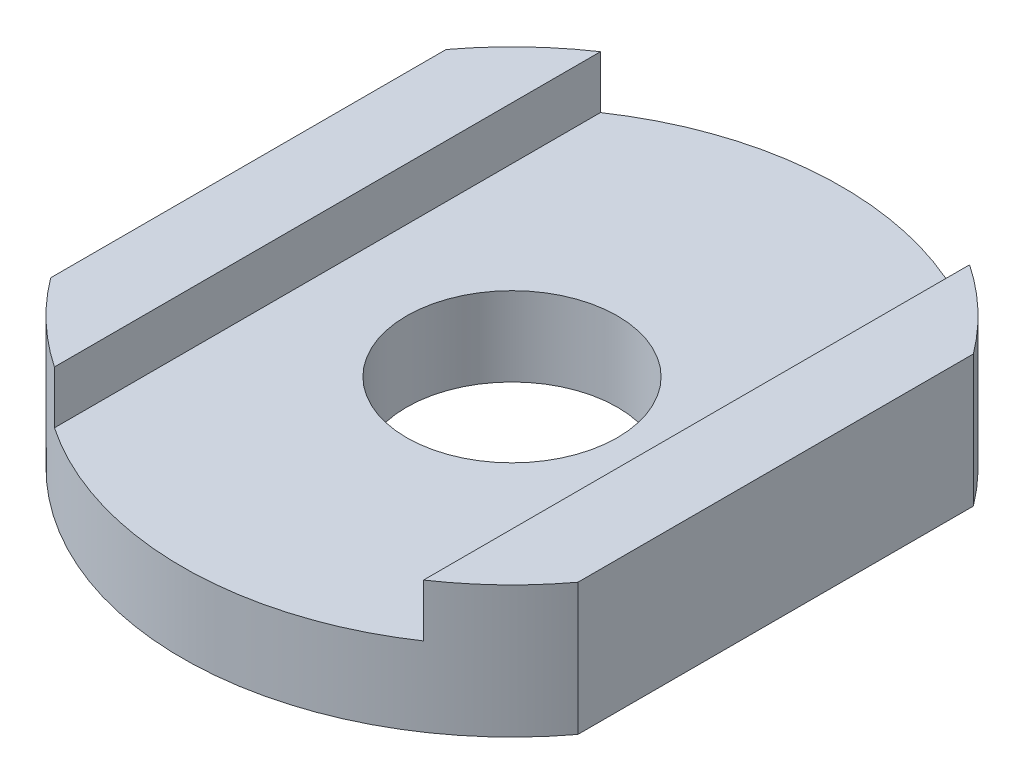
ISO-10303-21;
HEADER;
FILE_DESCRIPTION(('STEP AP214'),'2;1');
FILE_NAME('part.step','',(''),(''),'','','');
FILE_SCHEMA(('AUTOMOTIVE_DESIGN { 1 0 10303 214 1 1 1 1 }'));
ENDSEC;
DATA;
#1=APPLICATION_CONTEXT('core data for automotive mechanical design processes');
#2=APPLICATION_PROTOCOL_DEFINITION('international standard','automotive_design',2000,#1);
#3=PRODUCT_CONTEXT('',#1,'mechanical');
#4=PRODUCT('Part','Part','',(#3));
#5=PRODUCT_RELATED_PRODUCT_CATEGORY('part','',(#4));
#6=PRODUCT_DEFINITION_FORMATION('','',#4);
#7=PRODUCT_DEFINITION_CONTEXT('part definition',#1,'design');
#8=PRODUCT_DEFINITION('design','',#6,#7);
#9=PRODUCT_DEFINITION_SHAPE('','',#8);
#10=(LENGTH_UNIT() NAMED_UNIT(*) SI_UNIT(.MILLI.,.METRE.));
#11=(NAMED_UNIT(*) PLANE_ANGLE_UNIT() SI_UNIT($,.RADIAN.));
#12=(NAMED_UNIT(*) SI_UNIT($,.STERADIAN.) SOLID_ANGLE_UNIT());
#13=UNCERTAINTY_MEASURE_WITH_UNIT(LENGTH_MEASURE(1.E-05),#10,'distance_accuracy_value','');
#14=(GEOMETRIC_REPRESENTATION_CONTEXT(3) GLOBAL_UNCERTAINTY_ASSIGNED_CONTEXT((#13)) GLOBAL_UNIT_ASSIGNED_CONTEXT((#10,
#11,#12)) REPRESENTATION_CONTEXT('',''));
#15=CARTESIAN_POINT('',(0.,0.,0.));
#16=DIRECTION('',(0.,0.,1.));
#17=DIRECTION('',(1.,0.,0.));
#18=AXIS2_PLACEMENT_3D('',#15,#16,#17);
#19=CARTESIAN_POINT('',(0.,3.,0.));
#20=DIRECTION('',(0.,1.,0.));
#21=DIRECTION('',(0.,0.,1.));
#22=AXIS2_PLACEMENT_3D('',#19,#20,#21);
#23=PLANE('',#22);
#24=DIRECTION('',(0.,0.,-1.));
#25=VECTOR('',#24,1.);
#26=CARTESIAN_POINT('',(-7.,3.,0.));
#27=LINE('',#26,#25);
#28=CARTESIAN_POINT('',(-7.,3.,10.356157588604));
#29=VERTEX_POINT('',#28);
#30=CARTESIAN_POINT('',(-7.,3.,-10.356157588604));
#31=VERTEX_POINT('',#30);
#32=EDGE_CURVE('E116',#29,#31,#27,.T.);
#33=ORIENTED_EDGE('',*,*,#32,.F.);
#34=CARTESIAN_POINT('',(0.,3.,0.));
#35=DIRECTION('',(0.,1.,0.));
#36=DIRECTION('',(0.,0.,1.));
#37=AXIS2_PLACEMENT_3D('',#34,#35,#36);
#38=CIRCLE('',#37,12.5);
#39=CARTESIAN_POINT('',(7.,3.,10.356157588604));
#40=VERTEX_POINT('',#39);
#41=EDGE_CURVE('E176',#29,#40,#38,.T.);
#42=ORIENTED_EDGE('',*,*,#41,.T.);
#43=DIRECTION('',(0.,0.,-1.));
#44=VECTOR('',#43,1.);
#45=CARTESIAN_POINT('',(7.,3.,0.));
#46=LINE('',#45,#44);
#47=CARTESIAN_POINT('',(7.,3.,-10.356157588604));
#48=VERTEX_POINT('',#47);
#49=EDGE_CURVE('E66',#40,#48,#46,.T.);
#50=ORIENTED_EDGE('',*,*,#49,.T.);
#51=CARTESIAN_POINT('',(0.,3.,0.));
#52=DIRECTION('',(0.,1.,0.));
#53=DIRECTION('',(0.,0.,1.));
#54=AXIS2_PLACEMENT_3D('',#51,#52,#53);
#55=CIRCLE('',#54,12.5);
#56=EDGE_CURVE('E61',#48,#31,#55,.T.);
#57=ORIENTED_EDGE('',*,*,#56,.T.);
#58=EDGE_LOOP('',(#33,#42,#50,#57));
#59=FACE_BOUND('',#58,.T.);
#60=CARTESIAN_POINT('',(0.,3.,0.));
#61=DIRECTION('',(0.,1.,0.));
#62=DIRECTION('',(0.,0.,1.));
#63=AXIS2_PLACEMENT_3D('',#60,#61,#62);
#64=CIRCLE('',#63,4.);
#65=CARTESIAN_POINT('',(0.,3.,4.));
#66=VERTEX_POINT('',#65);
#67=EDGE_CURVE('E172',#66,#66,#64,.T.);
#68=ORIENTED_EDGE('',*,*,#67,.F.);
#69=EDGE_LOOP('',(#68));
#70=FACE_BOUND('',#69,.T.);
#71=ADVANCED_FACE('F45',(#59,#70),#23,.T.);
#72=CARTESIAN_POINT('',(0.,3.,0.));
#73=DIRECTION('',(0.,-1.,0.));
#74=DIRECTION('',(0.,0.,-1.));
#75=AXIS2_PLACEMENT_3D('',#72,#73,#74);
#76=CYLINDRICAL_SURFACE('',#75,12.5);
#77=DIRECTION('',(0.,-1.,0.));
#78=VECTOR('',#77,1.);
#79=CARTESIAN_POINT('',(10.,3.,7.5));
#80=LINE('',#79,#78);
#81=CARTESIAN_POINT('',(10.,5.,7.5));
#82=VERTEX_POINT('',#81);
#83=CARTESIAN_POINT('',(10.,0.,7.5));
#84=VERTEX_POINT('',#83);
#85=EDGE_CURVE('E11',#82,#84,#80,.T.);
#86=ORIENTED_EDGE('',*,*,#85,.F.);
#87=CARTESIAN_POINT('',(0.,5.,0.));
#88=DIRECTION('',(0.,1.,0.));
#89=DIRECTION('',(0.,0.,1.));
#90=AXIS2_PLACEMENT_3D('',#87,#88,#89);
#91=CIRCLE('',#90,12.5);
#92=CARTESIAN_POINT('',(7.,5.,10.356157588604));
#93=VERTEX_POINT('',#92);
#94=EDGE_CURVE('E160',#93,#82,#91,.T.);
#95=ORIENTED_EDGE('',*,*,#94,.F.);
#96=DIRECTION('',(0.,-1.,0.));
#97=VECTOR('',#96,1.);
#98=CARTESIAN_POINT('',(7.,5.,10.356157588604));
#99=LINE('',#98,#97);
#100=EDGE_CURVE('E141',#93,#40,#99,.T.);
#101=ORIENTED_EDGE('',*,*,#100,.T.);
#102=ORIENTED_EDGE('',*,*,#41,.F.);
#103=DIRECTION('',(0.,-1.,0.));
#104=VECTOR('',#103,1.);
#105=CARTESIAN_POINT('',(-7.,5.,10.356157588604));
#106=LINE('',#105,#104);
#107=CARTESIAN_POINT('',(-7.,5.,10.356157588604));
#108=VERTEX_POINT('',#107);
#109=EDGE_CURVE('E119',#108,#29,#106,.T.);
#110=ORIENTED_EDGE('',*,*,#109,.F.);
#111=CARTESIAN_POINT('',(0.,5.,0.));
#112=DIRECTION('',(0.,1.,0.));
#113=DIRECTION('',(0.,0.,1.));
#114=AXIS2_PLACEMENT_3D('',#111,#112,#113);
#115=CIRCLE('',#114,12.5);
#116=CARTESIAN_POINT('',(-10.,5.,7.5));
#117=VERTEX_POINT('',#116);
#118=EDGE_CURVE('E134',#117,#108,#115,.T.);
#119=ORIENTED_EDGE('',*,*,#118,.F.);
#120=DIRECTION('',(0.,-1.,0.));
#121=VECTOR('',#120,1.);
#122=CARTESIAN_POINT('',(-10.,3.,7.5));
#123=LINE('',#122,#121);
#124=CARTESIAN_POINT('',(-10.,0.,7.5));
#125=VERTEX_POINT('',#124);
#126=EDGE_CURVE('E182',#117,#125,#123,.T.);
#127=ORIENTED_EDGE('',*,*,#126,.T.);
#128=CARTESIAN_POINT('',(0.,0.,0.));
#129=DIRECTION('',(0.,1.,0.));
#130=DIRECTION('',(0.,0.,1.));
#131=AXIS2_PLACEMENT_3D('',#128,#129,#130);
#132=CIRCLE('',#131,12.5);
#133=EDGE_CURVE('E186',#125,#84,#132,.T.);
#134=ORIENTED_EDGE('',*,*,#133,.T.);
#135=EDGE_LOOP('',(#86,#95,#101,#102,#110,#119,#127,#134));
#136=FACE_BOUND('',#135,.T.);
#137=ADVANCED_FACE('F217',(#136),#76,.T.);
#138=CARTESIAN_POINT('',(10.,3.,0.));
#139=DIRECTION('',(1.,0.,0.));
#140=DIRECTION('',(0.,0.,-1.));
#141=AXIS2_PLACEMENT_3D('',#138,#139,#140);
#142=PLANE('',#141);
#143=DIRECTION('',(0.,0.,1.));
#144=VECTOR('',#143,1.);
#145=CARTESIAN_POINT('',(10.,0.,0.));
#146=LINE('',#145,#144);
#147=CARTESIAN_POINT('',(10.,0.,-7.5));
#148=VERTEX_POINT('',#147);
#149=EDGE_CURVE('E189',#148,#84,#146,.T.);
#150=ORIENTED_EDGE('',*,*,#149,.F.);
#151=DIRECTION('',(0.,-1.,0.));
#152=VECTOR('',#151,1.);
#153=CARTESIAN_POINT('',(10.,3.,-7.5));
#154=LINE('',#153,#152);
#155=CARTESIAN_POINT('',(10.,5.,-7.5));
#156=VERTEX_POINT('',#155);
#157=EDGE_CURVE('E54',#156,#148,#154,.T.);
#158=ORIENTED_EDGE('',*,*,#157,.F.);
#159=DIRECTION('',(0.,0.,1.));
#160=VECTOR('',#159,1.);
#161=CARTESIAN_POINT('',(10.,5.,0.));
#162=LINE('',#161,#160);
#163=EDGE_CURVE('E150',#156,#82,#162,.T.);
#164=ORIENTED_EDGE('',*,*,#163,.T.);
#165=ORIENTED_EDGE('',*,*,#85,.T.);
#166=EDGE_LOOP('',(#150,#158,#164,#165));
#167=FACE_BOUND('',#166,.T.);
#168=ADVANCED_FACE('F214',(#167),#142,.T.);
#169=CARTESIAN_POINT('',(0.,3.,0.));
#170=DIRECTION('',(0.,-1.,0.));
#171=DIRECTION('',(0.,0.,-1.));
#172=AXIS2_PLACEMENT_3D('',#169,#170,#171);
#173=CYLINDRICAL_SURFACE('',#172,12.5);
#174=CARTESIAN_POINT('',(0.,0.,0.));
#175=DIRECTION('',(0.,1.,0.));
#176=DIRECTION('',(0.,0.,1.));
#177=AXIS2_PLACEMENT_3D('',#174,#175,#176);
#178=CIRCLE('',#177,12.5);
#179=CARTESIAN_POINT('',(-10.,0.,-7.5));
#180=VERTEX_POINT('',#179);
#181=EDGE_CURVE('E193',#148,#180,#178,.T.);
#182=ORIENTED_EDGE('',*,*,#181,.T.);
#183=DIRECTION('',(0.,-1.,0.));
#184=VECTOR('',#183,1.);
#185=CARTESIAN_POINT('',(-10.,3.,-7.5));
#186=LINE('',#185,#184);
#187=CARTESIAN_POINT('',(-10.,5.,-7.5));
#188=VERTEX_POINT('',#187);
#189=EDGE_CURVE('E125',#188,#180,#186,.T.);
#190=ORIENTED_EDGE('',*,*,#189,.F.);
#191=CARTESIAN_POINT('',(0.,5.,0.));
#192=DIRECTION('',(0.,1.,0.));
#193=DIRECTION('',(0.,0.,1.));
#194=AXIS2_PLACEMENT_3D('',#191,#192,#193);
#195=CIRCLE('',#194,12.5);
#196=CARTESIAN_POINT('',(-7.,5.,-10.356157588604));
#197=VERTEX_POINT('',#196);
#198=EDGE_CURVE('E122',#197,#188,#195,.T.);
#199=ORIENTED_EDGE('',*,*,#198,.F.);
#200=DIRECTION('',(0.,-1.,0.));
#201=VECTOR('',#200,1.);
#202=CARTESIAN_POINT('',(-7.,5.,-10.356157588604));
#203=LINE('',#202,#201);
#204=EDGE_CURVE('E110',#197,#31,#203,.T.);
#205=ORIENTED_EDGE('',*,*,#204,.T.);
#206=ORIENTED_EDGE('',*,*,#56,.F.);
#207=DIRECTION('',(0.,-1.,0.));
#208=VECTOR('',#207,1.);
#209=CARTESIAN_POINT('',(7.,5.,-10.356157588604));
#210=LINE('',#209,#208);
#211=CARTESIAN_POINT('',(7.,5.,-10.356157588604));
#212=VERTEX_POINT('',#211);
#213=EDGE_CURVE('E137',#212,#48,#210,.T.);
#214=ORIENTED_EDGE('',*,*,#213,.F.);
#215=CARTESIAN_POINT('',(0.,5.,0.));
#216=DIRECTION('',(0.,1.,0.));
#217=DIRECTION('',(0.,0.,1.));
#218=AXIS2_PLACEMENT_3D('',#215,#216,#217);
#219=CIRCLE('',#218,12.5);
#220=EDGE_CURVE('E154',#156,#212,#219,.T.);
#221=ORIENTED_EDGE('',*,*,#220,.F.);
#222=ORIENTED_EDGE('',*,*,#157,.T.);
#223=EDGE_LOOP('',(#182,#190,#199,#205,#206,#214,#221,#222));
#224=FACE_BOUND('',#223,.T.);
#225=ADVANCED_FACE('F123',(#224),#173,.T.);
#226=CARTESIAN_POINT('',(0.,3.,0.));
#227=DIRECTION('',(0.,-1.,0.));
#228=DIRECTION('',(0.,0.,-1.));
#229=AXIS2_PLACEMENT_3D('',#226,#227,#228);
#230=CYLINDRICAL_SURFACE('',#229,4.);
#231=ORIENTED_EDGE('',*,*,#67,.T.);
#232=EDGE_LOOP('',(#231));
#233=FACE_BOUND('',#232,.T.);
#234=CARTESIAN_POINT('',(0.,0.,0.));
#235=DIRECTION('',(0.,1.,0.));
#236=DIRECTION('',(0.,0.,1.));
#237=AXIS2_PLACEMENT_3D('',#234,#235,#236);
#238=CIRCLE('',#237,4.);
#239=CARTESIAN_POINT('',(0.,0.,4.));
#240=VERTEX_POINT('',#239);
#241=EDGE_CURVE('E171',#240,#240,#238,.T.);
#242=ORIENTED_EDGE('',*,*,#241,.F.);
#243=EDGE_LOOP('',(#242));
#244=FACE_BOUND('',#243,.T.);
#245=ADVANCED_FACE('F47',(#233,#244),#230,.F.);
#246=CARTESIAN_POINT('',(-10.,3.,0.));
#247=DIRECTION('',(1.,0.,0.));
#248=DIRECTION('',(0.,0.,-1.));
#249=AXIS2_PLACEMENT_3D('',#246,#247,#248);
#250=PLANE('',#249);
#251=DIRECTION('',(0.,0.,1.));
#252=VECTOR('',#251,1.);
#253=CARTESIAN_POINT('',(-10.,0.,0.));
#254=LINE('',#253,#252);
#255=EDGE_CURVE('E177',#180,#125,#254,.T.);
#256=ORIENTED_EDGE('',*,*,#255,.T.);
#257=ORIENTED_EDGE('',*,*,#126,.F.);
#258=DIRECTION('',(0.,0.,1.));
#259=VECTOR('',#258,1.);
#260=CARTESIAN_POINT('',(-10.,5.,0.));
#261=LINE('',#260,#259);
#262=EDGE_CURVE('E130',#188,#117,#261,.T.);
#263=ORIENTED_EDGE('',*,*,#262,.F.);
#264=ORIENTED_EDGE('',*,*,#189,.T.);
#265=EDGE_LOOP('',(#256,#257,#263,#264));
#266=FACE_BOUND('',#265,.T.);
#267=ADVANCED_FACE('F231',(#266),#250,.F.);
#268=CARTESIAN_POINT('',(0.,0.,0.));
#269=DIRECTION('',(0.,1.,0.));
#270=DIRECTION('',(0.,0.,1.));
#271=AXIS2_PLACEMENT_3D('',#268,#269,#270);
#272=PLANE('',#271);
#273=ORIENTED_EDGE('',*,*,#149,.T.);
#274=ORIENTED_EDGE('',*,*,#133,.F.);
#275=ORIENTED_EDGE('',*,*,#255,.F.);
#276=ORIENTED_EDGE('',*,*,#181,.F.);
#277=EDGE_LOOP('',(#273,#274,#275,#276));
#278=FACE_BOUND('',#277,.T.);
#279=ORIENTED_EDGE('',*,*,#241,.T.);
#280=EDGE_LOOP('',(#279));
#281=FACE_BOUND('',#280,.T.);
#282=ADVANCED_FACE('F211',(#278,#281),#272,.F.);
#283=CARTESIAN_POINT('',(7.,5.,0.));
#284=DIRECTION('',(1.,0.,0.));
#285=DIRECTION('',(0.,0.,-1.));
#286=AXIS2_PLACEMENT_3D('',#283,#284,#285);
#287=PLANE('',#286);
#288=ORIENTED_EDGE('',*,*,#49,.F.);
#289=ORIENTED_EDGE('',*,*,#100,.F.);
#290=DIRECTION('',(0.,0.,1.));
#291=VECTOR('',#290,1.);
#292=CARTESIAN_POINT('',(7.,5.,0.));
#293=LINE('',#292,#291);
#294=EDGE_CURVE('E157',#212,#93,#293,.T.);
#295=ORIENTED_EDGE('',*,*,#294,.F.);
#296=ORIENTED_EDGE('',*,*,#213,.T.);
#297=EDGE_LOOP('',(#288,#289,#295,#296));
#298=FACE_BOUND('',#297,.T.);
#299=ADVANCED_FACE('F223',(#298),#287,.F.);
#300=CARTESIAN_POINT('',(0.,5.,0.));
#301=DIRECTION('',(0.,1.,0.));
#302=DIRECTION('',(0.,0.,1.));
#303=AXIS2_PLACEMENT_3D('',#300,#301,#302);
#304=PLANE('',#303);
#305=ORIENTED_EDGE('',*,*,#163,.F.);
#306=ORIENTED_EDGE('',*,*,#220,.T.);
#307=ORIENTED_EDGE('',*,*,#294,.T.);
#308=ORIENTED_EDGE('',*,*,#94,.T.);
#309=EDGE_LOOP('',(#305,#306,#307,#308));
#310=FACE_BOUND('',#309,.T.);
#311=ADVANCED_FACE('F219',(#310),#304,.T.);
#312=CARTESIAN_POINT('',(-7.,5.,0.));
#313=DIRECTION('',(1.,0.,0.));
#314=DIRECTION('',(0.,0.,-1.));
#315=AXIS2_PLACEMENT_3D('',#312,#313,#314);
#316=PLANE('',#315);
#317=ORIENTED_EDGE('',*,*,#109,.T.);
#318=ORIENTED_EDGE('',*,*,#32,.T.);
#319=ORIENTED_EDGE('',*,*,#204,.F.);
#320=DIRECTION('',(0.,0.,1.));
#321=VECTOR('',#320,1.);
#322=CARTESIAN_POINT('',(-7.,5.,0.));
#323=LINE('',#322,#321);
#324=EDGE_CURVE('E115',#197,#108,#323,.T.);
#325=ORIENTED_EDGE('',*,*,#324,.T.);
#326=EDGE_LOOP('',(#317,#318,#319,#325));
#327=FACE_BOUND('',#326,.T.);
#328=ADVANCED_FACE('F113',(#327),#316,.T.);
#329=CARTESIAN_POINT('',(0.,5.,0.));
#330=DIRECTION('',(0.,1.,0.));
#331=DIRECTION('',(0.,0.,1.));
#332=AXIS2_PLACEMENT_3D('',#329,#330,#331);
#333=PLANE('',#332);
#334=ORIENTED_EDGE('',*,*,#324,.F.);
#335=ORIENTED_EDGE('',*,*,#198,.T.);
#336=ORIENTED_EDGE('',*,*,#262,.T.);
#337=ORIENTED_EDGE('',*,*,#118,.T.);
#338=EDGE_LOOP('',(#334,#335,#336,#337));
#339=FACE_BOUND('',#338,.T.);
#340=ADVANCED_FACE('F132',(#339),#333,.T.);
#341=CLOSED_SHELL('',(#71,#137,#168,#225,#245,#267,#282,#299,#311,#328,#340));
#342=MANIFOLD_SOLID_BREP('B2',#341);
#343=ADVANCED_BREP_SHAPE_REPRESENTATION('',(#18,#342),#14);
#344=SHAPE_DEFINITION_REPRESENTATION(#9,#343);
ENDSEC;
END-ISO-10303-21;
